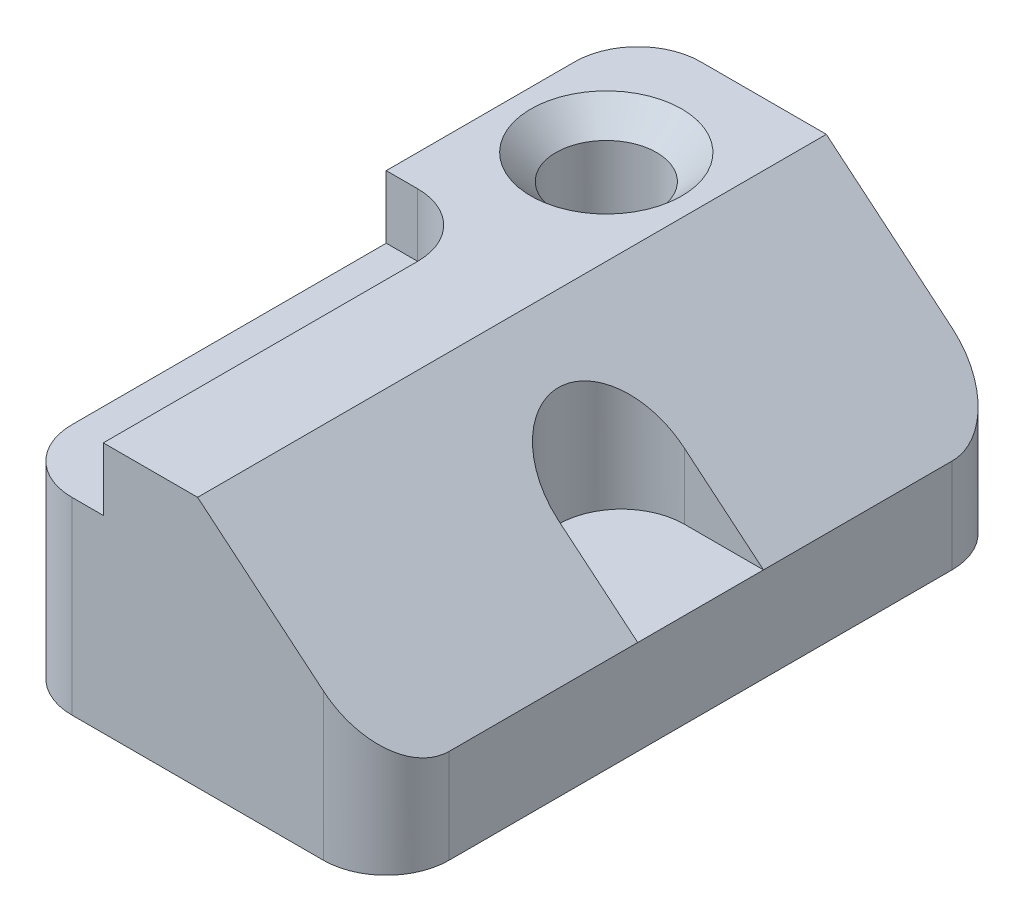
ISO-10303-21;
HEADER;
FILE_DESCRIPTION(('STEP AP214'),'2;1');
FILE_NAME('part.step','',(''),(''),'','','');
FILE_SCHEMA(('AUTOMOTIVE_DESIGN { 1 0 10303 214 1 1 1 1 }'));
ENDSEC;
DATA;
#1=APPLICATION_CONTEXT('core data for automotive mechanical design processes');
#2=APPLICATION_PROTOCOL_DEFINITION('international standard','automotive_design',2000,#1);
#3=PRODUCT_CONTEXT('',#1,'mechanical');
#4=PRODUCT('Part','Part','',(#3));
#5=PRODUCT_RELATED_PRODUCT_CATEGORY('part','',(#4));
#6=PRODUCT_DEFINITION_FORMATION('','',#4);
#7=PRODUCT_DEFINITION_CONTEXT('part definition',#1,'design');
#8=PRODUCT_DEFINITION('design','',#6,#7);
#9=PRODUCT_DEFINITION_SHAPE('','',#8);
#10=(LENGTH_UNIT() NAMED_UNIT(*) SI_UNIT(.MILLI.,.METRE.));
#11=(NAMED_UNIT(*) PLANE_ANGLE_UNIT() SI_UNIT($,.RADIAN.));
#12=(NAMED_UNIT(*) SI_UNIT($,.STERADIAN.) SOLID_ANGLE_UNIT());
#13=UNCERTAINTY_MEASURE_WITH_UNIT(LENGTH_MEASURE(1.E-05),#10,'distance_accuracy_value','');
#14=(GEOMETRIC_REPRESENTATION_CONTEXT(3) GLOBAL_UNCERTAINTY_ASSIGNED_CONTEXT((#13)) GLOBAL_UNIT_ASSIGNED_CONTEXT((#10,
#11,#12)) REPRESENTATION_CONTEXT('',''));
#15=CARTESIAN_POINT('',(0.,0.,0.));
#16=DIRECTION('',(0.,0.,1.));
#17=DIRECTION('',(1.,0.,0.));
#18=AXIS2_PLACEMENT_3D('',#15,#16,#17);
#19=CARTESIAN_POINT('',(76.2,0.,127.));
#20=DIRECTION('',(0.,1.,0.));
#21=DIRECTION('',(-1.,0.,0.));
#22=AXIS2_PLACEMENT_3D('',#19,#20,#21);
#23=PLANE('',#22);
#24=CARTESIAN_POINT('',(19.05,0.,25.4));
#25=DIRECTION('',(0.,1.,0.));
#26=DIRECTION('',(0.,0.,1.));
#27=AXIS2_PLACEMENT_3D('',#24,#25,#26);
#28=CIRCLE('',#27,10.16);
#29=CARTESIAN_POINT('',(19.05,0.,35.56));
#30=VERTEX_POINT('',#29);
#31=EDGE_CURVE('E216',#30,#30,#28,.T.);
#32=ORIENTED_EDGE('',*,*,#31,.T.);
#33=EDGE_LOOP('',(#32));
#34=FACE_BOUND('',#33,.T.);
#35=DIRECTION('',(0.,0.,-1.));
#36=VECTOR('',#35,1.);
#37=CARTESIAN_POINT('',(0.,0.,127.));
#38=LINE('',#37,#36);
#39=CARTESIAN_POINT('',(0.,0.,114.3));
#40=VERTEX_POINT('',#39);
#41=CARTESIAN_POINT('',(0.,0.,12.7));
#42=VERTEX_POINT('',#41);
#43=EDGE_CURVE('E235',#40,#42,#38,.T.);
#44=ORIENTED_EDGE('',*,*,#43,.T.);
#45=CARTESIAN_POINT('',(12.7,0.,12.7));
#46=DIRECTION('',(0.,1.,0.));
#47=DIRECTION('',(-1.,0.,0.));
#48=AXIS2_PLACEMENT_3D('',#45,#46,#47);
#49=CIRCLE('',#48,12.7);
#50=CARTESIAN_POINT('',(12.7,0.,0.));
#51=VERTEX_POINT('',#50);
#52=EDGE_CURVE('E309',#42,#51,#49,.F.);
#53=ORIENTED_EDGE('',*,*,#52,.T.);
#54=DIRECTION('',(1.,0.,0.));
#55=VECTOR('',#54,1.);
#56=CARTESIAN_POINT('',(76.2,0.,0.));
#57=LINE('',#56,#55);
#58=CARTESIAN_POINT('',(63.5,0.,0.));
#59=VERTEX_POINT('',#58);
#60=EDGE_CURVE('E222',#51,#59,#57,.T.);
#61=ORIENTED_EDGE('',*,*,#60,.T.);
#62=CARTESIAN_POINT('',(63.5,0.,12.7));
#63=DIRECTION('',(0.,1.,0.));
#64=DIRECTION('',(-1.,0.,0.));
#65=AXIS2_PLACEMENT_3D('',#62,#63,#64);
#66=CIRCLE('',#65,12.7);
#67=CARTESIAN_POINT('',(76.2,0.,12.7));
#68=VERTEX_POINT('',#67);
#69=EDGE_CURVE('E306',#59,#68,#66,.F.);
#70=ORIENTED_EDGE('',*,*,#69,.T.);
#71=DIRECTION('',(0.,0.,-1.));
#72=VECTOR('',#71,1.);
#73=CARTESIAN_POINT('',(76.2,0.,127.));
#74=LINE('',#73,#72);
#75=CARTESIAN_POINT('',(76.2,0.,114.3));
#76=VERTEX_POINT('',#75);
#77=EDGE_CURVE('E260',#76,#68,#74,.T.);
#78=ORIENTED_EDGE('',*,*,#77,.F.);
#79=CARTESIAN_POINT('',(63.5,0.,114.3));
#80=DIRECTION('',(0.,1.,0.));
#81=DIRECTION('',(-1.,0.,0.));
#82=AXIS2_PLACEMENT_3D('',#79,#80,#81);
#83=CIRCLE('',#82,12.7);
#84=CARTESIAN_POINT('',(63.5,0.,127.));
#85=VERTEX_POINT('',#84);
#86=EDGE_CURVE('E300',#76,#85,#83,.F.);
#87=ORIENTED_EDGE('',*,*,#86,.T.);
#88=DIRECTION('',(1.,0.,0.));
#89=VECTOR('',#88,1.);
#90=CARTESIAN_POINT('',(76.2,0.,127.));
#91=LINE('',#90,#89);
#92=CARTESIAN_POINT('',(12.7,0.,127.));
#93=VERTEX_POINT('',#92);
#94=EDGE_CURVE('E223',#93,#85,#91,.T.);
#95=ORIENTED_EDGE('',*,*,#94,.F.);
#96=CARTESIAN_POINT('',(12.7,0.,114.3));
#97=DIRECTION('',(0.,1.,0.));
#98=DIRECTION('',(-1.,0.,0.));
#99=AXIS2_PLACEMENT_3D('',#96,#97,#98);
#100=CIRCLE('',#99,12.7);
#101=EDGE_CURVE('E303',#93,#40,#100,.F.);
#102=ORIENTED_EDGE('',*,*,#101,.T.);
#103=EDGE_LOOP('',(#44,#53,#61,#70,#78,#87,#95,#102));
#104=FACE_BOUND('',#103,.T.);
#105=ADVANCED_FACE('F41',(#34,#104),#23,.F.);
#106=CARTESIAN_POINT('',(76.2,19.05,127.));
#107=DIRECTION('',(-1.,0.,0.));
#108=DIRECTION('',(0.,0.,1.));
#109=AXIS2_PLACEMENT_3D('',#106,#107,#108);
#110=PLANE('',#109);
#111=ORIENTED_EDGE('',*,*,#77,.T.);
#112=DIRECTION('',(0.,1.,0.));
#113=VECTOR('',#112,1.);
#114=CARTESIAN_POINT('',(76.2,19.05,12.7));
#115=LINE('',#114,#113);
#116=CARTESIAN_POINT('',(76.2,19.05,12.7));
#117=VERTEX_POINT('',#116);
#118=EDGE_CURVE('E324',#68,#117,#115,.T.);
#119=ORIENTED_EDGE('',*,*,#118,.T.);
#120=DIRECTION('',(0.,0.,-1.));
#121=VECTOR('',#120,1.);
#122=CARTESIAN_POINT('',(76.2,19.05,127.));
#123=LINE('',#122,#121);
#124=CARTESIAN_POINT('',(76.2,19.05,50.8));
#125=VERTEX_POINT('',#124);
#126=EDGE_CURVE('E256',#125,#117,#123,.T.);
#127=ORIENTED_EDGE('',*,*,#126,.F.);
#128=DIRECTION('',(0.,0.,1.));
#129=VECTOR('',#128,1.);
#130=CARTESIAN_POINT('',(76.2,19.05,50.8));
#131=LINE('',#130,#129);
#132=CARTESIAN_POINT('',(76.2,19.05,76.2));
#133=VERTEX_POINT('',#132);
#134=EDGE_CURVE('E178',#125,#133,#131,.T.);
#135=ORIENTED_EDGE('',*,*,#134,.T.);
#136=CARTESIAN_POINT('',(76.2,19.05,114.3));
#137=VERTEX_POINT('',#136);
#138=EDGE_CURVE('E257',#137,#133,#123,.T.);
#139=ORIENTED_EDGE('',*,*,#138,.F.);
#140=DIRECTION('',(0.,1.,0.));
#141=VECTOR('',#140,1.);
#142=CARTESIAN_POINT('',(76.2,19.05,114.3));
#143=LINE('',#142,#141);
#144=EDGE_CURVE('E321',#137,#76,#143,.F.);
#145=ORIENTED_EDGE('',*,*,#144,.T.);
#146=EDGE_LOOP('',(#111,#119,#127,#135,#139,#145));
#147=FACE_BOUND('',#146,.T.);
#148=ADVANCED_FACE('F391',(#147),#110,.F.);
#149=CARTESIAN_POINT('',(38.1,50.8,127.));
#150=DIRECTION('',(-0.64018439966448,-0.768221279597376,0.));
#151=DIRECTION('',(0.768221279597376,-0.64018439966448,0.));
#152=AXIS2_PLACEMENT_3D('',#149,#150,#151);
#153=PLANE('',#152);
#154=ORIENTED_EDGE('',*,*,#126,.T.);
#155=CARTESIAN_POINT('',(63.5,29.6333333333333,12.7));
#156=DIRECTION('',(-0.64018439966448,-0.768221279597376,0.));
#157=DIRECTION('',(0.768221279597376,-0.64018439966448,0.));
#158=AXIS2_PLACEMENT_3D('',#155,#156,#157);
#159=ELLIPSE('',#158,16.5316951473357,12.7);
#160=CARTESIAN_POINT('',(63.5,29.6333333333333,0.));
#161=VERTEX_POINT('',#160);
#162=EDGE_CURVE('E330',#117,#161,#159,.F.);
#163=ORIENTED_EDGE('',*,*,#162,.T.);
#164=DIRECTION('',(-0.768221279597376,0.64018439966448,0.));
#165=VECTOR('',#164,1.);
#166=CARTESIAN_POINT('',(38.1,50.8,0.));
#167=LINE('',#166,#165);
#168=CARTESIAN_POINT('',(38.1,50.8,0.));
#169=VERTEX_POINT('',#168);
#170=EDGE_CURVE('E239',#161,#169,#167,.T.);
#171=ORIENTED_EDGE('',*,*,#170,.T.);
#172=DIRECTION('',(0.,0.,-1.));
#173=VECTOR('',#172,1.);
#174=CARTESIAN_POINT('',(38.1,50.8,127.));
#175=LINE('',#174,#173);
#176=CARTESIAN_POINT('',(38.1,50.8,127.));
#177=VERTEX_POINT('',#176);
#178=EDGE_CURVE('E252',#177,#169,#175,.T.);
#179=ORIENTED_EDGE('',*,*,#178,.F.);
#180=DIRECTION('',(-0.768221279597376,0.64018439966448,0.));
#181=VECTOR('',#180,1.);
#182=CARTESIAN_POINT('',(38.1,50.8,127.));
#183=LINE('',#182,#181);
#184=CARTESIAN_POINT('',(63.5,29.6333333333333,127.));
#185=VERTEX_POINT('',#184);
#186=EDGE_CURVE('E227',#185,#177,#183,.T.);
#187=ORIENTED_EDGE('',*,*,#186,.F.);
#188=CARTESIAN_POINT('',(63.5,29.6333333333333,114.3));
#189=DIRECTION('',(-0.64018439966448,-0.768221279597376,0.));
#190=DIRECTION('',(-0.768221279597376,0.64018439966448,0.));
#191=AXIS2_PLACEMENT_3D('',#188,#189,#190);
#192=ELLIPSE('',#191,16.5316951473357,12.7);
#193=EDGE_CURVE('E63',#185,#137,#192,.F.);
#194=ORIENTED_EDGE('',*,*,#193,.T.);
#195=ORIENTED_EDGE('',*,*,#138,.T.);
#196=DIRECTION('',(-0.768221279597376,0.64018439966448,0.));
#197=VECTOR('',#196,1.);
#198=CARTESIAN_POINT('',(38.1,50.8,76.2));
#199=LINE('',#198,#197);
#200=CARTESIAN_POINT('',(60.198,32.385,76.2));
#201=VERTEX_POINT('',#200);
#202=EDGE_CURVE('E174',#133,#201,#199,.T.);
#203=ORIENTED_EDGE('',*,*,#202,.T.);
#204=CARTESIAN_POINT('',(60.198,32.385,63.5));
#205=DIRECTION('',(-0.64018439966448,-0.768221279597376,0.));
#206=DIRECTION('',(-0.768221279597376,0.64018439966448,0.));
#207=AXIS2_PLACEMENT_3D('',#204,#205,#206);
#208=ELLIPSE('',#207,16.5316951473357,12.7);
#209=CARTESIAN_POINT('',(60.198,32.385,50.8));
#210=VERTEX_POINT('',#209);
#211=EDGE_CURVE('E163',#201,#210,#208,.T.);
#212=ORIENTED_EDGE('',*,*,#211,.T.);
#213=DIRECTION('',(0.768221279597376,-0.64018439966448,0.));
#214=VECTOR('',#213,1.);
#215=CARTESIAN_POINT('',(38.1,50.8,50.8));
#216=LINE('',#215,#214);
#217=EDGE_CURVE('E289',#210,#125,#216,.T.);
#218=ORIENTED_EDGE('',*,*,#217,.T.);
#219=EDGE_LOOP('',(#154,#163,#171,#179,#187,#194,#195,#203,#212,#218));
#220=FACE_BOUND('',#219,.T.);
#221=ADVANCED_FACE('F351',(#220),#153,.F.);
#222=CARTESIAN_POINT('',(0.,50.8,127.));
#223=DIRECTION('',(0.,-1.,0.));
#224=DIRECTION('',(0.,0.,-1.));
#225=AXIS2_PLACEMENT_3D('',#222,#223,#224);
#226=PLANE('',#225);
#227=CARTESIAN_POINT('',(19.05,50.8,25.4));
#228=DIRECTION('',(0.,-1.,0.));
#229=DIRECTION('',(0.,0.,-1.));
#230=AXIS2_PLACEMENT_3D('',#227,#228,#229);
#231=CIRCLE('',#230,15.24);
#232=CARTESIAN_POINT('',(19.05,50.8,10.16));
#233=VERTEX_POINT('',#232);
#234=EDGE_CURVE('E268',#233,#233,#231,.T.);
#235=ORIENTED_EDGE('',*,*,#234,.T.);
#236=EDGE_LOOP('',(#235));
#237=FACE_BOUND('',#236,.T.);
#238=DIRECTION('',(-1.,0.,0.));
#239=VECTOR('',#238,1.);
#240=CARTESIAN_POINT('',(0.,50.8,0.));
#241=LINE('',#240,#239);
#242=CARTESIAN_POINT('',(12.7,50.8,0.));
#243=VERTEX_POINT('',#242);
#244=EDGE_CURVE('E228',#169,#243,#241,.T.);
#245=ORIENTED_EDGE('',*,*,#244,.T.);
#246=CARTESIAN_POINT('',(12.7,50.8,12.7));
#247=DIRECTION('',(0.,-1.,0.));
#248=DIRECTION('',(0.,0.,-1.));
#249=AXIS2_PLACEMENT_3D('',#246,#247,#248);
#250=CIRCLE('',#249,12.7);
#251=CARTESIAN_POINT('',(0.,50.8,12.7));
#252=VERTEX_POINT('',#251);
#253=EDGE_CURVE('E318',#243,#252,#250,.F.);
#254=ORIENTED_EDGE('',*,*,#253,.T.);
#255=DIRECTION('',(0.,0.,-1.));
#256=VECTOR('',#255,1.);
#257=CARTESIAN_POINT('',(0.,50.8,127.));
#258=LINE('',#257,#256);
#259=CARTESIAN_POINT('',(0.,50.8,50.8));
#260=VERTEX_POINT('',#259);
#261=EDGE_CURVE('E248',#260,#252,#258,.T.);
#262=ORIENTED_EDGE('',*,*,#261,.F.);
#263=DIRECTION('',(-1.,0.,0.));
#264=VECTOR('',#263,1.);
#265=CARTESIAN_POINT('',(0.,50.8,50.8));
#266=LINE('',#265,#264);
#267=CARTESIAN_POINT('',(6.35,50.8,50.8));
#268=VERTEX_POINT('',#267);
#269=EDGE_CURVE('E196',#268,#260,#266,.T.);
#270=ORIENTED_EDGE('',*,*,#269,.F.);
#271=CARTESIAN_POINT('',(6.35,50.8,63.5));
#272=DIRECTION('',(0.,-1.,0.));
#273=DIRECTION('',(0.,0.,-1.));
#274=AXIS2_PLACEMENT_3D('',#271,#272,#273);
#275=CIRCLE('',#274,12.7);
#276=CARTESIAN_POINT('',(19.05,50.8,63.5));
#277=VERTEX_POINT('',#276);
#278=EDGE_CURVE('E282',#268,#277,#275,.T.);
#279=ORIENTED_EDGE('',*,*,#278,.T.);
#280=DIRECTION('',(0.,0.,-1.));
#281=VECTOR('',#280,1.);
#282=CARTESIAN_POINT('',(19.05,50.8,50.8));
#283=LINE('',#282,#281);
#284=CARTESIAN_POINT('',(19.05,50.8,127.));
#285=VERTEX_POINT('',#284);
#286=EDGE_CURVE('E190',#285,#277,#283,.T.);
#287=ORIENTED_EDGE('',*,*,#286,.F.);
#288=DIRECTION('',(-1.,0.,0.));
#289=VECTOR('',#288,1.);
#290=CARTESIAN_POINT('',(0.,50.8,127.));
#291=LINE('',#290,#289);
#292=EDGE_CURVE('E231',#177,#285,#291,.T.);
#293=ORIENTED_EDGE('',*,*,#292,.F.);
#294=ORIENTED_EDGE('',*,*,#178,.T.);
#295=EDGE_LOOP('',(#245,#254,#262,#270,#279,#287,#293,#294));
#296=FACE_BOUND('',#295,.T.);
#297=ADVANCED_FACE('F358',(#237,#296),#226,.F.);
#298=CARTESIAN_POINT('',(0.,0.,127.));
#299=DIRECTION('',(1.,0.,0.));
#300=DIRECTION('',(0.,0.,-1.));
#301=AXIS2_PLACEMENT_3D('',#298,#299,#300);
#302=PLANE('',#301);
#303=ORIENTED_EDGE('',*,*,#261,.T.);
#304=DIRECTION('',(0.,-1.,0.));
#305=VECTOR('',#304,1.);
#306=CARTESIAN_POINT('',(0.,0.,12.7));
#307=LINE('',#306,#305);
#308=EDGE_CURVE('E296',#252,#42,#307,.T.);
#309=ORIENTED_EDGE('',*,*,#308,.T.);
#310=ORIENTED_EDGE('',*,*,#43,.F.);
#311=DIRECTION('',(0.,-1.,0.));
#312=VECTOR('',#311,1.);
#313=CARTESIAN_POINT('',(0.,0.,114.3));
#314=LINE('',#313,#312);
#315=CARTESIAN_POINT('',(0.,38.1,114.3));
#316=VERTEX_POINT('',#315);
#317=EDGE_CURVE('E293',#40,#316,#314,.F.);
#318=ORIENTED_EDGE('',*,*,#317,.T.);
#319=DIRECTION('',(0.,0.,1.));
#320=VECTOR('',#319,1.);
#321=CARTESIAN_POINT('',(0.,38.1,50.8));
#322=LINE('',#321,#320);
#323=CARTESIAN_POINT('',(0.,38.1,50.8));
#324=VERTEX_POINT('',#323);
#325=EDGE_CURVE('E192',#324,#316,#322,.T.);
#326=ORIENTED_EDGE('',*,*,#325,.F.);
#327=DIRECTION('',(0.,1.,0.));
#328=VECTOR('',#327,1.);
#329=CARTESIAN_POINT('',(0.,38.1,50.8));
#330=LINE('',#329,#328);
#331=EDGE_CURVE('E212',#324,#260,#330,.T.);
#332=ORIENTED_EDGE('',*,*,#331,.T.);
#333=EDGE_LOOP('',(#303,#309,#310,#318,#326,#332));
#334=FACE_BOUND('',#333,.T.);
#335=ADVANCED_FACE('F377',(#334),#302,.F.);
#336=CARTESIAN_POINT('',(0.,0.,127.));
#337=DIRECTION('',(0.,0.,-1.));
#338=DIRECTION('',(-1.,0.,0.));
#339=AXIS2_PLACEMENT_3D('',#336,#337,#338);
#340=PLANE('',#339);
#341=DIRECTION('',(1.,0.,0.));
#342=VECTOR('',#341,1.);
#343=CARTESIAN_POINT('',(0.,38.1,127.));
#344=LINE('',#343,#342);
#345=CARTESIAN_POINT('',(12.7,38.1,127.));
#346=VERTEX_POINT('',#345);
#347=CARTESIAN_POINT('',(19.05,38.1,127.));
#348=VERTEX_POINT('',#347);
#349=EDGE_CURVE('E195',#346,#348,#344,.T.);
#350=ORIENTED_EDGE('',*,*,#349,.F.);
#351=DIRECTION('',(0.,-1.,0.));
#352=VECTOR('',#351,1.);
#353=CARTESIAN_POINT('',(12.7,0.,127.));
#354=LINE('',#353,#352);
#355=EDGE_CURVE('E50',#346,#93,#354,.T.);
#356=ORIENTED_EDGE('',*,*,#355,.T.);
#357=ORIENTED_EDGE('',*,*,#94,.T.);
#358=DIRECTION('',(0.,1.,0.));
#359=VECTOR('',#358,1.);
#360=CARTESIAN_POINT('',(63.5,0.,127.));
#361=LINE('',#360,#359);
#362=EDGE_CURVE('E333',#85,#185,#361,.T.);
#363=ORIENTED_EDGE('',*,*,#362,.T.);
#364=ORIENTED_EDGE('',*,*,#186,.T.);
#365=ORIENTED_EDGE('',*,*,#292,.T.);
#366=DIRECTION('',(0.,1.,0.));
#367=VECTOR('',#366,1.);
#368=CARTESIAN_POINT('',(19.05,38.1,127.));
#369=LINE('',#368,#367);
#370=EDGE_CURVE('E206',#348,#285,#369,.T.);
#371=ORIENTED_EDGE('',*,*,#370,.F.);
#372=EDGE_LOOP('',(#350,#356,#357,#363,#364,#365,#371));
#373=FACE_BOUND('',#372,.T.);
#374=ADVANCED_FACE('F340',(#373),#340,.F.);
#375=CARTESIAN_POINT('',(0.,0.,0.));
#376=DIRECTION('',(0.,0.,-1.));
#377=DIRECTION('',(-1.,0.,0.));
#378=AXIS2_PLACEMENT_3D('',#375,#376,#377);
#379=PLANE('',#378);
#380=ORIENTED_EDGE('',*,*,#60,.F.);
#381=DIRECTION('',(0.,-1.,0.));
#382=VECTOR('',#381,1.);
#383=CARTESIAN_POINT('',(12.7,50.8,0.));
#384=LINE('',#383,#382);
#385=EDGE_CURVE('E315',#51,#243,#384,.F.);
#386=ORIENTED_EDGE('',*,*,#385,.T.);
#387=ORIENTED_EDGE('',*,*,#244,.F.);
#388=ORIENTED_EDGE('',*,*,#170,.F.);
#389=DIRECTION('',(0.,1.,0.));
#390=VECTOR('',#389,1.);
#391=CARTESIAN_POINT('',(63.5,0.,0.));
#392=LINE('',#391,#390);
#393=EDGE_CURVE('E312',#161,#59,#392,.F.);
#394=ORIENTED_EDGE('',*,*,#393,.T.);
#395=EDGE_LOOP('',(#380,#386,#387,#388,#394));
#396=FACE_BOUND('',#395,.T.);
#397=ADVANCED_FACE('F385',(#396),#379,.T.);
#398=CARTESIAN_POINT('',(19.05,0.,25.4));
#399=DIRECTION('',(0.,1.,0.));
#400=DIRECTION('',(0.,0.,1.));
#401=AXIS2_PLACEMENT_3D('',#398,#399,#400);
#402=CYLINDRICAL_SURFACE('',#401,10.16);
#403=CARTESIAN_POINT('',(19.05,45.72,25.4));
#404=DIRECTION('',(0.,-1.,0.));
#405=DIRECTION('',(0.,0.,-1.));
#406=AXIS2_PLACEMENT_3D('',#403,#404,#405);
#407=CIRCLE('',#406,10.16);
#408=CARTESIAN_POINT('',(19.05,45.72,15.24));
#409=VERTEX_POINT('',#408);
#410=EDGE_CURVE('E264',#409,#409,#407,.F.);
#411=ORIENTED_EDGE('',*,*,#410,.T.);
#412=EDGE_LOOP('',(#411));
#413=FACE_BOUND('',#412,.T.);
#414=ORIENTED_EDGE('',*,*,#31,.F.);
#415=EDGE_LOOP('',(#414));
#416=FACE_BOUND('',#415,.T.);
#417=ADVANCED_FACE('F420',(#413,#416),#402,.F.);
#418=CARTESIAN_POINT('',(19.05,45.72,25.4));
#419=DIRECTION('',(0.,1.,0.));
#420=DIRECTION('',(0.,0.,1.));
#421=AXIS2_PLACEMENT_3D('',#418,#419,#420);
#422=CONICAL_SURFACE('',#421,10.16,0.785398163397449);
#423=ORIENTED_EDGE('',*,*,#234,.F.);
#424=EDGE_LOOP('',(#423));
#425=FACE_BOUND('',#424,.T.);
#426=ORIENTED_EDGE('',*,*,#410,.F.);
#427=EDGE_LOOP('',(#426));
#428=FACE_BOUND('',#427,.T.);
#429=ADVANCED_FACE('F415',(#425,#428),#422,.F.);
#430=CARTESIAN_POINT('',(0.,38.1,50.8));
#431=DIRECTION('',(0.,0.,-1.));
#432=DIRECTION('',(-1.,0.,0.));
#433=AXIS2_PLACEMENT_3D('',#430,#431,#432);
#434=PLANE('',#433);
#435=DIRECTION('',(-1.,0.,0.));
#436=VECTOR('',#435,1.);
#437=CARTESIAN_POINT('',(0.,38.1,50.8));
#438=LINE('',#437,#436);
#439=CARTESIAN_POINT('',(6.35,38.1,50.8));
#440=VERTEX_POINT('',#439);
#441=EDGE_CURVE('E203',#440,#324,#438,.T.);
#442=ORIENTED_EDGE('',*,*,#441,.F.);
#443=DIRECTION('',(0.,1.,0.));
#444=VECTOR('',#443,1.);
#445=CARTESIAN_POINT('',(6.35,50.8,50.8));
#446=LINE('',#445,#444);
#447=EDGE_CURVE('E272',#440,#268,#446,.T.);
#448=ORIENTED_EDGE('',*,*,#447,.T.);
#449=ORIENTED_EDGE('',*,*,#269,.T.);
#450=ORIENTED_EDGE('',*,*,#331,.F.);
#451=EDGE_LOOP('',(#442,#448,#449,#450));
#452=FACE_BOUND('',#451,.T.);
#453=ADVANCED_FACE('F371',(#452),#434,.F.);
#454=CARTESIAN_POINT('',(19.05,38.1,50.8));
#455=DIRECTION('',(1.,0.,0.));
#456=DIRECTION('',(0.,0.,-1.));
#457=AXIS2_PLACEMENT_3D('',#454,#455,#456);
#458=PLANE('',#457);
#459=ORIENTED_EDGE('',*,*,#286,.T.);
#460=DIRECTION('',(0.,1.,0.));
#461=VECTOR('',#460,1.);
#462=CARTESIAN_POINT('',(19.05,38.1,63.5));
#463=LINE('',#462,#461);
#464=CARTESIAN_POINT('',(19.05,38.1,63.5));
#465=VERTEX_POINT('',#464);
#466=EDGE_CURVE('E276',#277,#465,#463,.F.);
#467=ORIENTED_EDGE('',*,*,#466,.T.);
#468=DIRECTION('',(0.,0.,-1.));
#469=VECTOR('',#468,1.);
#470=CARTESIAN_POINT('',(19.05,38.1,50.8));
#471=LINE('',#470,#469);
#472=EDGE_CURVE('E199',#348,#465,#471,.T.);
#473=ORIENTED_EDGE('',*,*,#472,.F.);
#474=ORIENTED_EDGE('',*,*,#370,.T.);
#475=EDGE_LOOP('',(#459,#467,#473,#474));
#476=FACE_BOUND('',#475,.T.);
#477=ADVANCED_FACE('F361',(#476),#458,.F.);
#478=CARTESIAN_POINT('',(0.,38.1,0.));
#479=DIRECTION('',(0.,1.,0.));
#480=DIRECTION('',(0.,0.,1.));
#481=AXIS2_PLACEMENT_3D('',#478,#479,#480);
#482=PLANE('',#481);
#483=ORIENTED_EDGE('',*,*,#325,.T.);
#484=CARTESIAN_POINT('',(12.7,38.1,114.3));
#485=DIRECTION('',(0.,1.,0.));
#486=DIRECTION('',(0.,0.,1.));
#487=AXIS2_PLACEMENT_3D('',#484,#485,#486);
#488=CIRCLE('',#487,12.7);
#489=EDGE_CURVE('E11',#316,#346,#488,.T.);
#490=ORIENTED_EDGE('',*,*,#489,.T.);
#491=ORIENTED_EDGE('',*,*,#349,.T.);
#492=ORIENTED_EDGE('',*,*,#472,.T.);
#493=CARTESIAN_POINT('',(6.35,38.1,63.5));
#494=DIRECTION('',(0.,1.,0.));
#495=DIRECTION('',(0.,0.,1.));
#496=AXIS2_PLACEMENT_3D('',#493,#494,#495);
#497=CIRCLE('',#496,12.7);
#498=EDGE_CURVE('E279',#465,#440,#497,.T.);
#499=ORIENTED_EDGE('',*,*,#498,.T.);
#500=ORIENTED_EDGE('',*,*,#441,.T.);
#501=EDGE_LOOP('',(#483,#490,#491,#492,#499,#500));
#502=FACE_BOUND('',#501,.T.);
#503=ADVANCED_FACE('F364',(#502),#482,.T.);
#504=CARTESIAN_POINT('',(6.35,38.1,63.5));
#505=DIRECTION('',(0.,-1.,0.));
#506=DIRECTION('',(0.,0.,-1.));
#507=AXIS2_PLACEMENT_3D('',#504,#505,#506);
#508=CYLINDRICAL_SURFACE('',#507,12.7);
#509=ORIENTED_EDGE('',*,*,#498,.F.);
#510=ORIENTED_EDGE('',*,*,#466,.F.);
#511=ORIENTED_EDGE('',*,*,#278,.F.);
#512=ORIENTED_EDGE('',*,*,#447,.F.);
#513=EDGE_LOOP('',(#509,#510,#511,#512));
#514=FACE_BOUND('',#513,.T.);
#515=ADVANCED_FACE('F368',(#514),#508,.F.);
#516=CARTESIAN_POINT('',(60.198,19.05,63.5));
#517=DIRECTION('',(0.,1.,0.));
#518=DIRECTION('',(0.,0.,1.));
#519=AXIS2_PLACEMENT_3D('',#516,#517,#518);
#520=CYLINDRICAL_SURFACE('',#519,12.7);
#521=DIRECTION('',(0.,1.,0.));
#522=VECTOR('',#521,1.);
#523=CARTESIAN_POINT('',(60.198,19.05,76.2));
#524=LINE('',#523,#522);
#525=CARTESIAN_POINT('',(60.198,19.05,76.2));
#526=VERTEX_POINT('',#525);
#527=EDGE_CURVE('E155',#526,#201,#524,.T.);
#528=ORIENTED_EDGE('',*,*,#527,.F.);
#529=CARTESIAN_POINT('',(60.198,19.05,63.5));
#530=DIRECTION('',(0.,1.,0.));
#531=DIRECTION('',(0.,0.,1.));
#532=AXIS2_PLACEMENT_3D('',#529,#530,#531);
#533=CIRCLE('',#532,12.7);
#534=CARTESIAN_POINT('',(60.198,19.05,50.8));
#535=VERTEX_POINT('',#534);
#536=EDGE_CURVE('E160',#535,#526,#533,.T.);
#537=ORIENTED_EDGE('',*,*,#536,.F.);
#538=DIRECTION('',(0.,1.,0.));
#539=VECTOR('',#538,1.);
#540=CARTESIAN_POINT('',(60.198,19.05,50.8));
#541=LINE('',#540,#539);
#542=EDGE_CURVE('E168',#535,#210,#541,.T.);
#543=ORIENTED_EDGE('',*,*,#542,.T.);
#544=ORIENTED_EDGE('',*,*,#211,.F.);
#545=EDGE_LOOP('',(#528,#537,#543,#544));
#546=FACE_BOUND('',#545,.T.);
#547=ADVANCED_FACE('F157',(#546),#520,.F.);
#548=CARTESIAN_POINT('',(76.2,19.05,50.8));
#549=DIRECTION('',(0.,0.,-1.));
#550=DIRECTION('',(-1.,0.,0.));
#551=AXIS2_PLACEMENT_3D('',#548,#549,#550);
#552=PLANE('',#551);
#553=ORIENTED_EDGE('',*,*,#542,.F.);
#554=DIRECTION('',(-1.,0.,0.));
#555=VECTOR('',#554,1.);
#556=CARTESIAN_POINT('',(76.2,19.05,50.8));
#557=LINE('',#556,#555);
#558=EDGE_CURVE('E169',#125,#535,#557,.T.);
#559=ORIENTED_EDGE('',*,*,#558,.F.);
#560=ORIENTED_EDGE('',*,*,#217,.F.);
#561=EDGE_LOOP('',(#553,#559,#560));
#562=FACE_BOUND('',#561,.T.);
#563=ADVANCED_FACE('F395',(#562),#552,.F.);
#564=CARTESIAN_POINT('',(60.198,19.05,76.2));
#565=DIRECTION('',(0.,0.,1.));
#566=DIRECTION('',(1.,0.,0.));
#567=AXIS2_PLACEMENT_3D('',#564,#565,#566);
#568=PLANE('',#567);
#569=DIRECTION('',(1.,0.,0.));
#570=VECTOR('',#569,1.);
#571=CARTESIAN_POINT('',(60.198,19.05,76.2));
#572=LINE('',#571,#570);
#573=EDGE_CURVE('E172',#526,#133,#572,.T.);
#574=ORIENTED_EDGE('',*,*,#573,.F.);
#575=ORIENTED_EDGE('',*,*,#527,.T.);
#576=ORIENTED_EDGE('',*,*,#202,.F.);
#577=EDGE_LOOP('',(#574,#575,#576));
#578=FACE_BOUND('',#577,.T.);
#579=ADVANCED_FACE('F173',(#578),#568,.F.);
#580=CARTESIAN_POINT('',(60.198,19.05,63.5));
#581=DIRECTION('',(0.,1.,0.));
#582=DIRECTION('',(0.,0.,1.));
#583=AXIS2_PLACEMENT_3D('',#580,#581,#582);
#584=PLANE('',#583);
#585=ORIENTED_EDGE('',*,*,#536,.T.);
#586=ORIENTED_EDGE('',*,*,#573,.T.);
#587=ORIENTED_EDGE('',*,*,#134,.F.);
#588=ORIENTED_EDGE('',*,*,#558,.T.);
#589=EDGE_LOOP('',(#585,#586,#587,#588));
#590=FACE_BOUND('',#589,.T.);
#591=ADVANCED_FACE('F180',(#590),#584,.T.);
#592=CARTESIAN_POINT('',(12.7,0.,12.7));
#593=DIRECTION('',(0.,1.,0.));
#594=DIRECTION('',(0.,0.,1.));
#595=AXIS2_PLACEMENT_3D('',#592,#593,#594);
#596=CYLINDRICAL_SURFACE('',#595,12.7);
#597=ORIENTED_EDGE('',*,*,#253,.F.);
#598=ORIENTED_EDGE('',*,*,#385,.F.);
#599=ORIENTED_EDGE('',*,*,#52,.F.);
#600=ORIENTED_EDGE('',*,*,#308,.F.);
#601=EDGE_LOOP('',(#597,#598,#599,#600));
#602=FACE_BOUND('',#601,.T.);
#603=ADVANCED_FACE('F380',(#602),#596,.T.);
#604=CARTESIAN_POINT('',(63.5,19.05,12.7));
#605=DIRECTION('',(0.,-1.,0.));
#606=DIRECTION('',(0.,0.,-1.));
#607=AXIS2_PLACEMENT_3D('',#604,#605,#606);
#608=CYLINDRICAL_SURFACE('',#607,12.7);
#609=ORIENTED_EDGE('',*,*,#69,.F.);
#610=ORIENTED_EDGE('',*,*,#393,.F.);
#611=ORIENTED_EDGE('',*,*,#162,.F.);
#612=ORIENTED_EDGE('',*,*,#118,.F.);
#613=EDGE_LOOP('',(#609,#610,#611,#612));
#614=FACE_BOUND('',#613,.T.);
#615=ADVANCED_FACE('F388',(#614),#608,.T.);
#616=CARTESIAN_POINT('',(12.7,0.,114.3));
#617=DIRECTION('',(0.,-1.,0.));
#618=DIRECTION('',(0.,0.,-1.));
#619=AXIS2_PLACEMENT_3D('',#616,#617,#618);
#620=CYLINDRICAL_SURFACE('',#619,12.7);
#621=ORIENTED_EDGE('',*,*,#489,.F.);
#622=ORIENTED_EDGE('',*,*,#317,.F.);
#623=ORIENTED_EDGE('',*,*,#101,.F.);
#624=ORIENTED_EDGE('',*,*,#355,.F.);
#625=EDGE_LOOP('',(#621,#622,#623,#624));
#626=FACE_BOUND('',#625,.T.);
#627=ADVANCED_FACE('F427',(#626),#620,.T.);
#628=CARTESIAN_POINT('',(63.5,0.,114.3));
#629=DIRECTION('',(0.,1.,0.));
#630=DIRECTION('',(0.,0.,1.));
#631=AXIS2_PLACEMENT_3D('',#628,#629,#630);
#632=CYLINDRICAL_SURFACE('',#631,12.7);
#633=ORIENTED_EDGE('',*,*,#86,.F.);
#634=ORIENTED_EDGE('',*,*,#144,.F.);
#635=ORIENTED_EDGE('',*,*,#193,.F.);
#636=ORIENTED_EDGE('',*,*,#362,.F.);
#637=EDGE_LOOP('',(#633,#634,#635,#636));
#638=FACE_BOUND('',#637,.T.);
#639=ADVANCED_FACE('F43',(#638),#632,.T.);
#640=CLOSED_SHELL('',(#105,#148,#221,#297,#335,#374,#397,#417,#429,#453,#477,#503,#515,#547,
#563,#579,#591,#603,#615,#627,#639));
#641=MANIFOLD_SOLID_BREP('B2',#640);
#642=ADVANCED_BREP_SHAPE_REPRESENTATION('',(#18,#641),#14);
#643=SHAPE_DEFINITION_REPRESENTATION(#9,#642);
ENDSEC;
END-ISO-10303-21;
